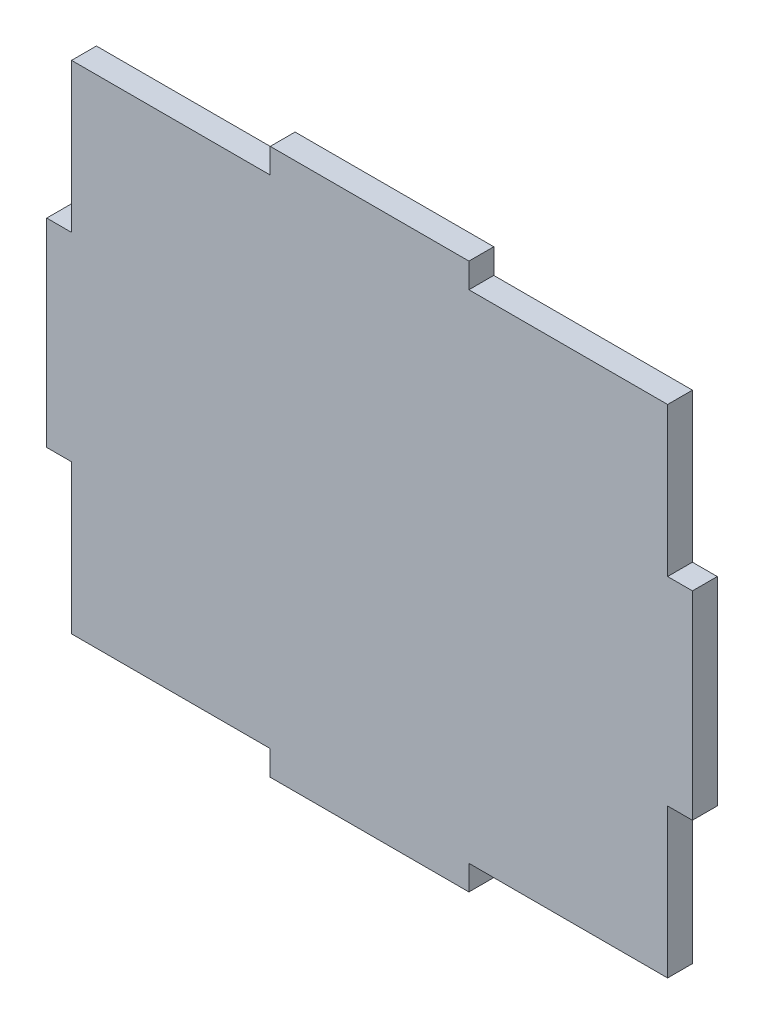
ISO-10303-21;
HEADER;
FILE_DESCRIPTION(('STEP AP214'),'2;1');
FILE_NAME('part.step','',(''),(''),'','','');
FILE_SCHEMA(('AUTOMOTIVE_DESIGN { 1 0 10303 214 1 1 1 1 }'));
ENDSEC;
DATA;
#1=APPLICATION_CONTEXT('core data for automotive mechanical design processes');
#2=APPLICATION_PROTOCOL_DEFINITION('international standard','automotive_design',2000,#1);
#3=PRODUCT_CONTEXT('',#1,'mechanical');
#4=PRODUCT('Part','Part','',(#3));
#5=PRODUCT_RELATED_PRODUCT_CATEGORY('part','',(#4));
#6=PRODUCT_DEFINITION_FORMATION('','',#4);
#7=PRODUCT_DEFINITION_CONTEXT('part definition',#1,'design');
#8=PRODUCT_DEFINITION('design','',#6,#7);
#9=PRODUCT_DEFINITION_SHAPE('','',#8);
#10=(LENGTH_UNIT() NAMED_UNIT(*) SI_UNIT(.MILLI.,.METRE.));
#11=(NAMED_UNIT(*) PLANE_ANGLE_UNIT() SI_UNIT($,.RADIAN.));
#12=(NAMED_UNIT(*) SI_UNIT($,.STERADIAN.) SOLID_ANGLE_UNIT());
#13=UNCERTAINTY_MEASURE_WITH_UNIT(LENGTH_MEASURE(1.E-05),#10,'distance_accuracy_value','');
#14=(GEOMETRIC_REPRESENTATION_CONTEXT(3) GLOBAL_UNCERTAINTY_ASSIGNED_CONTEXT((#13)) GLOBAL_UNIT_ASSIGNED_CONTEXT((#10,
#11,#12)) REPRESENTATION_CONTEXT('',''));
#15=CARTESIAN_POINT('',(0.,0.,0.));
#16=DIRECTION('',(0.,0.,1.));
#17=DIRECTION('',(1.,0.,0.));
#18=AXIS2_PLACEMENT_3D('',#15,#16,#17);
#19=CARTESIAN_POINT('',(-30.,-25.,1.25));
#20=DIRECTION('',(0.,1.,0.));
#21=DIRECTION('',(-1.,0.,0.));
#22=AXIS2_PLACEMENT_3D('',#19,#20,#21);
#23=PLANE('',#22);
#24=DIRECTION('',(1.,0.,0.));
#25=VECTOR('',#24,1.);
#26=CARTESIAN_POINT('',(-30.,-25.,-1.25));
#27=LINE('',#26,#25);
#28=CARTESIAN_POINT('',(-30.,-25.,-1.25));
#29=VERTEX_POINT('',#28);
#30=CARTESIAN_POINT('',(-10.,-25.,-1.25));
#31=VERTEX_POINT('',#30);
#32=EDGE_CURVE('E212',#29,#31,#27,.T.);
#33=ORIENTED_EDGE('',*,*,#32,.T.);
#34=DIRECTION('',(0.,0.,-1.));
#35=VECTOR('',#34,1.);
#36=CARTESIAN_POINT('',(-10.,-25.,1.25));
#37=LINE('',#36,#35);
#38=CARTESIAN_POINT('',(-10.,-25.,1.25));
#39=VERTEX_POINT('',#38);
#40=EDGE_CURVE('E11',#39,#31,#37,.T.);
#41=ORIENTED_EDGE('',*,*,#40,.F.);
#42=DIRECTION('',(1.,0.,0.));
#43=VECTOR('',#42,1.);
#44=CARTESIAN_POINT('',(-30.,-25.,1.25));
#45=LINE('',#44,#43);
#46=CARTESIAN_POINT('',(-30.,-25.,1.25));
#47=VERTEX_POINT('',#46);
#48=EDGE_CURVE('E270',#47,#39,#45,.T.);
#49=ORIENTED_EDGE('',*,*,#48,.F.);
#50=DIRECTION('',(0.,0.,-1.));
#51=VECTOR('',#50,1.);
#52=CARTESIAN_POINT('',(-30.,-25.,1.25));
#53=LINE('',#52,#51);
#54=EDGE_CURVE('E208',#47,#29,#53,.T.);
#55=ORIENTED_EDGE('',*,*,#54,.T.);
#56=EDGE_LOOP('',(#33,#41,#49,#55));
#57=FACE_BOUND('',#56,.T.);
#58=ADVANCED_FACE('F39',(#57),#23,.F.);
#59=CARTESIAN_POINT('',(-10.,-25.,1.25));
#60=DIRECTION('',(1.,0.,0.));
#61=DIRECTION('',(0.,1.,0.));
#62=AXIS2_PLACEMENT_3D('',#59,#60,#61);
#63=PLANE('',#62);
#64=DIRECTION('',(0.,-1.,0.));
#65=VECTOR('',#64,1.);
#66=CARTESIAN_POINT('',(-10.,-25.,-1.25));
#67=LINE('',#66,#65);
#68=CARTESIAN_POINT('',(-10.,-27.5,-1.25));
#69=VERTEX_POINT('',#68);
#70=EDGE_CURVE('E216',#31,#69,#67,.T.);
#71=ORIENTED_EDGE('',*,*,#70,.T.);
#72=DIRECTION('',(0.,0.,-1.));
#73=VECTOR('',#72,1.);
#74=CARTESIAN_POINT('',(-10.,-27.5,1.25));
#75=LINE('',#74,#73);
#76=CARTESIAN_POINT('',(-10.,-27.5,1.25));
#77=VERTEX_POINT('',#76);
#78=EDGE_CURVE('E48',#77,#69,#75,.T.);
#79=ORIENTED_EDGE('',*,*,#78,.F.);
#80=DIRECTION('',(0.,-1.,0.));
#81=VECTOR('',#80,1.);
#82=CARTESIAN_POINT('',(-10.,-25.,1.25));
#83=LINE('',#82,#81);
#84=EDGE_CURVE('E135',#39,#77,#83,.T.);
#85=ORIENTED_EDGE('',*,*,#84,.F.);
#86=ORIENTED_EDGE('',*,*,#40,.T.);
#87=EDGE_LOOP('',(#71,#79,#85,#86));
#88=FACE_BOUND('',#87,.T.);
#89=ADVANCED_FACE('F420',(#88),#63,.F.);
#90=CARTESIAN_POINT('',(-10.,-27.5,1.25));
#91=DIRECTION('',(0.,1.,0.));
#92=DIRECTION('',(0.,0.,1.));
#93=AXIS2_PLACEMENT_3D('',#90,#91,#92);
#94=PLANE('',#93);
#95=DIRECTION('',(1.,0.,0.));
#96=VECTOR('',#95,1.);
#97=CARTESIAN_POINT('',(-10.,-27.5,-1.25));
#98=LINE('',#97,#96);
#99=CARTESIAN_POINT('',(10.,-27.5,-1.25));
#100=VERTEX_POINT('',#99);
#101=EDGE_CURVE('E219',#69,#100,#98,.T.);
#102=ORIENTED_EDGE('',*,*,#101,.T.);
#103=DIRECTION('',(0.,0.,-1.));
#104=VECTOR('',#103,1.);
#105=CARTESIAN_POINT('',(10.,-27.5,1.25));
#106=LINE('',#105,#104);
#107=CARTESIAN_POINT('',(10.,-27.5,1.25));
#108=VERTEX_POINT('',#107);
#109=EDGE_CURVE('E329',#108,#100,#106,.T.);
#110=ORIENTED_EDGE('',*,*,#109,.F.);
#111=DIRECTION('',(1.,0.,0.));
#112=VECTOR('',#111,1.);
#113=CARTESIAN_POINT('',(-10.,-27.5,1.25));
#114=LINE('',#113,#112);
#115=EDGE_CURVE('E339',#77,#108,#114,.T.);
#116=ORIENTED_EDGE('',*,*,#115,.F.);
#117=ORIENTED_EDGE('',*,*,#78,.T.);
#118=EDGE_LOOP('',(#102,#110,#116,#117));
#119=FACE_BOUND('',#118,.T.);
#120=ADVANCED_FACE('F337',(#119),#94,.F.);
#121=CARTESIAN_POINT('',(10.,-25.,1.25));
#122=DIRECTION('',(-1.,0.,0.));
#123=DIRECTION('',(0.,-1.,0.));
#124=AXIS2_PLACEMENT_3D('',#121,#122,#123);
#125=PLANE('',#124);
#126=DIRECTION('',(0.,1.,0.));
#127=VECTOR('',#126,1.);
#128=CARTESIAN_POINT('',(10.,-25.,-1.25));
#129=LINE('',#128,#127);
#130=CARTESIAN_POINT('',(10.,-25.,-1.25));
#131=VERTEX_POINT('',#130);
#132=EDGE_CURVE('E222',#100,#131,#129,.T.);
#133=ORIENTED_EDGE('',*,*,#132,.T.);
#134=DIRECTION('',(0.,0.,-1.));
#135=VECTOR('',#134,1.);
#136=CARTESIAN_POINT('',(10.,-25.,1.25));
#137=LINE('',#136,#135);
#138=CARTESIAN_POINT('',(10.,-25.,1.25));
#139=VERTEX_POINT('',#138);
#140=EDGE_CURVE('E325',#139,#131,#137,.T.);
#141=ORIENTED_EDGE('',*,*,#140,.F.);
#142=DIRECTION('',(0.,1.,0.));
#143=VECTOR('',#142,1.);
#144=CARTESIAN_POINT('',(10.,-25.,1.25));
#145=LINE('',#144,#143);
#146=EDGE_CURVE('E358',#108,#139,#145,.T.);
#147=ORIENTED_EDGE('',*,*,#146,.F.);
#148=ORIENTED_EDGE('',*,*,#109,.T.);
#149=EDGE_LOOP('',(#133,#141,#147,#148));
#150=FACE_BOUND('',#149,.T.);
#151=ADVANCED_FACE('F348',(#150),#125,.F.);
#152=CARTESIAN_POINT('',(30.,-25.,1.25));
#153=DIRECTION('',(0.,1.,0.));
#154=DIRECTION('',(-1.,0.,0.));
#155=AXIS2_PLACEMENT_3D('',#152,#153,#154);
#156=PLANE('',#155);
#157=DIRECTION('',(1.,0.,0.));
#158=VECTOR('',#157,1.);
#159=CARTESIAN_POINT('',(30.,-25.,-1.25));
#160=LINE('',#159,#158);
#161=CARTESIAN_POINT('',(30.,-25.,-1.25));
#162=VERTEX_POINT('',#161);
#163=EDGE_CURVE('E225',#131,#162,#160,.T.);
#164=ORIENTED_EDGE('',*,*,#163,.T.);
#165=DIRECTION('',(0.,0.,-1.));
#166=VECTOR('',#165,1.);
#167=CARTESIAN_POINT('',(30.,-25.,1.25));
#168=LINE('',#167,#166);
#169=CARTESIAN_POINT('',(30.,-25.,1.25));
#170=VERTEX_POINT('',#169);
#171=EDGE_CURVE('E321',#170,#162,#168,.T.);
#172=ORIENTED_EDGE('',*,*,#171,.F.);
#173=DIRECTION('',(1.,0.,0.));
#174=VECTOR('',#173,1.);
#175=CARTESIAN_POINT('',(30.,-25.,1.25));
#176=LINE('',#175,#174);
#177=EDGE_CURVE('E354',#139,#170,#176,.T.);
#178=ORIENTED_EDGE('',*,*,#177,.F.);
#179=ORIENTED_EDGE('',*,*,#140,.T.);
#180=EDGE_LOOP('',(#164,#172,#178,#179));
#181=FACE_BOUND('',#180,.T.);
#182=ADVANCED_FACE('F352',(#181),#156,.F.);
#183=CARTESIAN_POINT('',(30.,-9.99999999999998,1.25));
#184=DIRECTION('',(-1.,0.,0.));
#185=DIRECTION('',(0.,-1.,0.));
#186=AXIS2_PLACEMENT_3D('',#183,#184,#185);
#187=PLANE('',#186);
#188=DIRECTION('',(0.,1.,0.));
#189=VECTOR('',#188,1.);
#190=CARTESIAN_POINT('',(30.,-9.99999999999998,-1.25));
#191=LINE('',#190,#189);
#192=CARTESIAN_POINT('',(30.,-9.99999999999998,-1.25));
#193=VERTEX_POINT('',#192);
#194=EDGE_CURVE('E228',#162,#193,#191,.T.);
#195=ORIENTED_EDGE('',*,*,#194,.T.);
#196=DIRECTION('',(0.,0.,-1.));
#197=VECTOR('',#196,1.);
#198=CARTESIAN_POINT('',(30.,-9.99999999999998,1.25));
#199=LINE('',#198,#197);
#200=CARTESIAN_POINT('',(30.,-9.99999999999998,1.25));
#201=VERTEX_POINT('',#200);
#202=EDGE_CURVE('E317',#201,#193,#199,.T.);
#203=ORIENTED_EDGE('',*,*,#202,.F.);
#204=DIRECTION('',(0.,1.,0.));
#205=VECTOR('',#204,1.);
#206=CARTESIAN_POINT('',(30.,-9.99999999999998,1.25));
#207=LINE('',#206,#205);
#208=EDGE_CURVE('E357',#170,#201,#207,.T.);
#209=ORIENTED_EDGE('',*,*,#208,.F.);
#210=ORIENTED_EDGE('',*,*,#171,.T.);
#211=EDGE_LOOP('',(#195,#203,#209,#210));
#212=FACE_BOUND('',#211,.T.);
#213=ADVANCED_FACE('F433',(#212),#187,.F.);
#214=CARTESIAN_POINT('',(32.5,-10.,1.25));
#215=DIRECTION('',(0.,1.,0.));
#216=DIRECTION('',(-1.,0.,0.));
#217=AXIS2_PLACEMENT_3D('',#214,#215,#216);
#218=PLANE('',#217);
#219=DIRECTION('',(1.,0.,0.));
#220=VECTOR('',#219,1.);
#221=CARTESIAN_POINT('',(32.5,-10.,-1.25));
#222=LINE('',#221,#220);
#223=CARTESIAN_POINT('',(32.5,-10.,-1.25));
#224=VERTEX_POINT('',#223);
#225=EDGE_CURVE('E231',#193,#224,#222,.T.);
#226=ORIENTED_EDGE('',*,*,#225,.T.);
#227=DIRECTION('',(0.,0.,-1.));
#228=VECTOR('',#227,1.);
#229=CARTESIAN_POINT('',(32.5,-10.,1.25));
#230=LINE('',#229,#228);
#231=CARTESIAN_POINT('',(32.5,-10.,1.25));
#232=VERTEX_POINT('',#231);
#233=EDGE_CURVE('E313',#232,#224,#230,.T.);
#234=ORIENTED_EDGE('',*,*,#233,.F.);
#235=DIRECTION('',(1.,0.,0.));
#236=VECTOR('',#235,1.);
#237=CARTESIAN_POINT('',(32.5,-10.,1.25));
#238=LINE('',#237,#236);
#239=EDGE_CURVE('E362',#201,#232,#238,.T.);
#240=ORIENTED_EDGE('',*,*,#239,.F.);
#241=ORIENTED_EDGE('',*,*,#202,.T.);
#242=EDGE_LOOP('',(#226,#234,#240,#241));
#243=FACE_BOUND('',#242,.T.);
#244=ADVANCED_FACE('F436',(#243),#218,.F.);
#245=CARTESIAN_POINT('',(32.5,10.,1.25));
#246=DIRECTION('',(-1.,0.,0.));
#247=DIRECTION('',(0.,0.,1.));
#248=AXIS2_PLACEMENT_3D('',#245,#246,#247);
#249=PLANE('',#248);
#250=DIRECTION('',(0.,1.,0.));
#251=VECTOR('',#250,1.);
#252=CARTESIAN_POINT('',(32.5,10.,-1.25));
#253=LINE('',#252,#251);
#254=CARTESIAN_POINT('',(32.5,10.,-1.25));
#255=VERTEX_POINT('',#254);
#256=EDGE_CURVE('E234',#224,#255,#253,.T.);
#257=ORIENTED_EDGE('',*,*,#256,.T.);
#258=DIRECTION('',(0.,0.,-1.));
#259=VECTOR('',#258,1.);
#260=CARTESIAN_POINT('',(32.5,10.,1.25));
#261=LINE('',#260,#259);
#262=CARTESIAN_POINT('',(32.5,10.,1.25));
#263=VERTEX_POINT('',#262);
#264=EDGE_CURVE('E309',#263,#255,#261,.T.);
#265=ORIENTED_EDGE('',*,*,#264,.F.);
#266=DIRECTION('',(0.,1.,0.));
#267=VECTOR('',#266,1.);
#268=CARTESIAN_POINT('',(32.5,10.,1.25));
#269=LINE('',#268,#267);
#270=EDGE_CURVE('E369',#232,#263,#269,.T.);
#271=ORIENTED_EDGE('',*,*,#270,.F.);
#272=ORIENTED_EDGE('',*,*,#233,.T.);
#273=EDGE_LOOP('',(#257,#265,#271,#272));
#274=FACE_BOUND('',#273,.T.);
#275=ADVANCED_FACE('F440',(#274),#249,.F.);
#276=CARTESIAN_POINT('',(32.5,10.,1.25));
#277=DIRECTION('',(0.,-1.,0.));
#278=DIRECTION('',(1.,0.,0.));
#279=AXIS2_PLACEMENT_3D('',#276,#277,#278);
#280=PLANE('',#279);
#281=DIRECTION('',(-1.,0.,0.));
#282=VECTOR('',#281,1.);
#283=CARTESIAN_POINT('',(32.5,10.,-1.25));
#284=LINE('',#283,#282);
#285=CARTESIAN_POINT('',(30.,9.99999999999998,-1.25));
#286=VERTEX_POINT('',#285);
#287=EDGE_CURVE('E237',#255,#286,#284,.T.);
#288=ORIENTED_EDGE('',*,*,#287,.T.);
#289=DIRECTION('',(0.,0.,-1.));
#290=VECTOR('',#289,1.);
#291=CARTESIAN_POINT('',(30.,9.99999999999998,1.25));
#292=LINE('',#291,#290);
#293=CARTESIAN_POINT('',(30.,9.99999999999998,1.25));
#294=VERTEX_POINT('',#293);
#295=EDGE_CURVE('E305',#294,#286,#292,.T.);
#296=ORIENTED_EDGE('',*,*,#295,.F.);
#297=DIRECTION('',(-1.,0.,0.));
#298=VECTOR('',#297,1.);
#299=CARTESIAN_POINT('',(32.5,10.,1.25));
#300=LINE('',#299,#298);
#301=EDGE_CURVE('E372',#263,#294,#300,.T.);
#302=ORIENTED_EDGE('',*,*,#301,.F.);
#303=ORIENTED_EDGE('',*,*,#264,.T.);
#304=EDGE_LOOP('',(#288,#296,#302,#303));
#305=FACE_BOUND('',#304,.T.);
#306=ADVANCED_FACE('F444',(#305),#280,.F.);
#307=CARTESIAN_POINT('',(30.,9.99999999999998,1.25));
#308=DIRECTION('',(-1.,0.,0.));
#309=DIRECTION('',(0.,-1.,0.));
#310=AXIS2_PLACEMENT_3D('',#307,#308,#309);
#311=PLANE('',#310);
#312=DIRECTION('',(0.,1.,0.));
#313=VECTOR('',#312,1.);
#314=CARTESIAN_POINT('',(30.,9.99999999999998,-1.25));
#315=LINE('',#314,#313);
#316=CARTESIAN_POINT('',(30.,25.,-1.25));
#317=VERTEX_POINT('',#316);
#318=EDGE_CURVE('E240',#286,#317,#315,.T.);
#319=ORIENTED_EDGE('',*,*,#318,.T.);
#320=DIRECTION('',(0.,0.,-1.));
#321=VECTOR('',#320,1.);
#322=CARTESIAN_POINT('',(30.,25.,1.25));
#323=LINE('',#322,#321);
#324=CARTESIAN_POINT('',(30.,25.,1.25));
#325=VERTEX_POINT('',#324);
#326=EDGE_CURVE('E301',#325,#317,#323,.T.);
#327=ORIENTED_EDGE('',*,*,#326,.F.);
#328=DIRECTION('',(0.,1.,0.));
#329=VECTOR('',#328,1.);
#330=CARTESIAN_POINT('',(30.,9.99999999999998,1.25));
#331=LINE('',#330,#329);
#332=EDGE_CURVE('E375',#294,#325,#331,.T.);
#333=ORIENTED_EDGE('',*,*,#332,.F.);
#334=ORIENTED_EDGE('',*,*,#295,.T.);
#335=EDGE_LOOP('',(#319,#327,#333,#334));
#336=FACE_BOUND('',#335,.T.);
#337=ADVANCED_FACE('F448',(#336),#311,.F.);
#338=CARTESIAN_POINT('',(30.,25.,1.25));
#339=DIRECTION('',(0.,-1.,0.));
#340=DIRECTION('',(1.,0.,0.));
#341=AXIS2_PLACEMENT_3D('',#338,#339,#340);
#342=PLANE('',#341);
#343=DIRECTION('',(-1.,0.,0.));
#344=VECTOR('',#343,1.);
#345=CARTESIAN_POINT('',(30.,25.,-1.25));
#346=LINE('',#345,#344);
#347=CARTESIAN_POINT('',(10.,25.,-1.25));
#348=VERTEX_POINT('',#347);
#349=EDGE_CURVE('E243',#317,#348,#346,.T.);
#350=ORIENTED_EDGE('',*,*,#349,.T.);
#351=DIRECTION('',(0.,0.,-1.));
#352=VECTOR('',#351,1.);
#353=CARTESIAN_POINT('',(10.,25.,1.25));
#354=LINE('',#353,#352);
#355=CARTESIAN_POINT('',(10.,25.,1.25));
#356=VERTEX_POINT('',#355);
#357=EDGE_CURVE('E297',#356,#348,#354,.T.);
#358=ORIENTED_EDGE('',*,*,#357,.F.);
#359=DIRECTION('',(-1.,0.,0.));
#360=VECTOR('',#359,1.);
#361=CARTESIAN_POINT('',(30.,25.,1.25));
#362=LINE('',#361,#360);
#363=EDGE_CURVE('E378',#325,#356,#362,.T.);
#364=ORIENTED_EDGE('',*,*,#363,.F.);
#365=ORIENTED_EDGE('',*,*,#326,.T.);
#366=EDGE_LOOP('',(#350,#358,#364,#365));
#367=FACE_BOUND('',#366,.T.);
#368=ADVANCED_FACE('F452',(#367),#342,.F.);
#369=CARTESIAN_POINT('',(10.,25.,1.25));
#370=DIRECTION('',(-1.,0.,0.));
#371=DIRECTION('',(0.,-1.,0.));
#372=AXIS2_PLACEMENT_3D('',#369,#370,#371);
#373=PLANE('',#372);
#374=DIRECTION('',(0.,1.,0.));
#375=VECTOR('',#374,1.);
#376=CARTESIAN_POINT('',(10.,25.,-1.25));
#377=LINE('',#376,#375);
#378=CARTESIAN_POINT('',(10.,27.5,-1.25));
#379=VERTEX_POINT('',#378);
#380=EDGE_CURVE('E246',#348,#379,#377,.T.);
#381=ORIENTED_EDGE('',*,*,#380,.T.);
#382=DIRECTION('',(0.,0.,-1.));
#383=VECTOR('',#382,1.);
#384=CARTESIAN_POINT('',(10.,27.5,1.25));
#385=LINE('',#384,#383);
#386=CARTESIAN_POINT('',(10.,27.5,1.25));
#387=VERTEX_POINT('',#386);
#388=EDGE_CURVE('E293',#387,#379,#385,.T.);
#389=ORIENTED_EDGE('',*,*,#388,.F.);
#390=DIRECTION('',(0.,1.,0.));
#391=VECTOR('',#390,1.);
#392=CARTESIAN_POINT('',(10.,25.,1.25));
#393=LINE('',#392,#391);
#394=EDGE_CURVE('E381',#356,#387,#393,.T.);
#395=ORIENTED_EDGE('',*,*,#394,.F.);
#396=ORIENTED_EDGE('',*,*,#357,.T.);
#397=EDGE_LOOP('',(#381,#389,#395,#396));
#398=FACE_BOUND('',#397,.T.);
#399=ADVANCED_FACE('F456',(#398),#373,.F.);
#400=CARTESIAN_POINT('',(-10.,27.5,1.25));
#401=DIRECTION('',(0.,-1.,0.));
#402=DIRECTION('',(0.,0.,-1.));
#403=AXIS2_PLACEMENT_3D('',#400,#401,#402);
#404=PLANE('',#403);
#405=DIRECTION('',(-1.,0.,0.));
#406=VECTOR('',#405,1.);
#407=CARTESIAN_POINT('',(-10.,27.5,-1.25));
#408=LINE('',#407,#406);
#409=CARTESIAN_POINT('',(-10.,27.5,-1.25));
#410=VERTEX_POINT('',#409);
#411=EDGE_CURVE('E249',#379,#410,#408,.T.);
#412=ORIENTED_EDGE('',*,*,#411,.T.);
#413=DIRECTION('',(0.,0.,-1.));
#414=VECTOR('',#413,1.);
#415=CARTESIAN_POINT('',(-10.,27.5,1.25));
#416=LINE('',#415,#414);
#417=CARTESIAN_POINT('',(-10.,27.5,1.25));
#418=VERTEX_POINT('',#417);
#419=EDGE_CURVE('E289',#418,#410,#416,.T.);
#420=ORIENTED_EDGE('',*,*,#419,.F.);
#421=DIRECTION('',(-1.,0.,0.));
#422=VECTOR('',#421,1.);
#423=CARTESIAN_POINT('',(-10.,27.5,1.25));
#424=LINE('',#423,#422);
#425=EDGE_CURVE('E384',#387,#418,#424,.T.);
#426=ORIENTED_EDGE('',*,*,#425,.F.);
#427=ORIENTED_EDGE('',*,*,#388,.T.);
#428=EDGE_LOOP('',(#412,#420,#426,#427));
#429=FACE_BOUND('',#428,.T.);
#430=ADVANCED_FACE('F460',(#429),#404,.F.);
#431=CARTESIAN_POINT('',(-10.,25.,1.25));
#432=DIRECTION('',(1.,0.,0.));
#433=DIRECTION('',(0.,1.,0.));
#434=AXIS2_PLACEMENT_3D('',#431,#432,#433);
#435=PLANE('',#434);
#436=DIRECTION('',(0.,-1.,0.));
#437=VECTOR('',#436,1.);
#438=CARTESIAN_POINT('',(-10.,25.,-1.25));
#439=LINE('',#438,#437);
#440=CARTESIAN_POINT('',(-10.,25.,-1.25));
#441=VERTEX_POINT('',#440);
#442=EDGE_CURVE('E252',#410,#441,#439,.T.);
#443=ORIENTED_EDGE('',*,*,#442,.T.);
#444=DIRECTION('',(0.,0.,-1.));
#445=VECTOR('',#444,1.);
#446=CARTESIAN_POINT('',(-10.,25.,1.25));
#447=LINE('',#446,#445);
#448=CARTESIAN_POINT('',(-10.,25.,1.25));
#449=VERTEX_POINT('',#448);
#450=EDGE_CURVE('E285',#449,#441,#447,.T.);
#451=ORIENTED_EDGE('',*,*,#450,.F.);
#452=DIRECTION('',(0.,-1.,0.));
#453=VECTOR('',#452,1.);
#454=CARTESIAN_POINT('',(-10.,25.,1.25));
#455=LINE('',#454,#453);
#456=EDGE_CURVE('E387',#418,#449,#455,.T.);
#457=ORIENTED_EDGE('',*,*,#456,.F.);
#458=ORIENTED_EDGE('',*,*,#419,.T.);
#459=EDGE_LOOP('',(#443,#451,#457,#458));
#460=FACE_BOUND('',#459,.T.);
#461=ADVANCED_FACE('F464',(#460),#435,.F.);
#462=CARTESIAN_POINT('',(-30.,25.,1.25));
#463=DIRECTION('',(0.,-1.,0.));
#464=DIRECTION('',(0.,0.,-1.));
#465=AXIS2_PLACEMENT_3D('',#462,#463,#464);
#466=PLANE('',#465);
#467=DIRECTION('',(-1.,0.,0.));
#468=VECTOR('',#467,1.);
#469=CARTESIAN_POINT('',(-30.,25.,-1.25));
#470=LINE('',#469,#468);
#471=CARTESIAN_POINT('',(-30.,25.,-1.25));
#472=VERTEX_POINT('',#471);
#473=EDGE_CURVE('E255',#441,#472,#470,.T.);
#474=ORIENTED_EDGE('',*,*,#473,.T.);
#475=DIRECTION('',(0.,0.,-1.));
#476=VECTOR('',#475,1.);
#477=CARTESIAN_POINT('',(-30.,25.,1.25));
#478=LINE('',#477,#476);
#479=CARTESIAN_POINT('',(-30.,25.,1.25));
#480=VERTEX_POINT('',#479);
#481=EDGE_CURVE('E281',#480,#472,#478,.T.);
#482=ORIENTED_EDGE('',*,*,#481,.F.);
#483=DIRECTION('',(-1.,0.,0.));
#484=VECTOR('',#483,1.);
#485=CARTESIAN_POINT('',(-30.,25.,1.25));
#486=LINE('',#485,#484);
#487=EDGE_CURVE('E390',#449,#480,#486,.T.);
#488=ORIENTED_EDGE('',*,*,#487,.F.);
#489=ORIENTED_EDGE('',*,*,#450,.T.);
#490=EDGE_LOOP('',(#474,#482,#488,#489));
#491=FACE_BOUND('',#490,.T.);
#492=ADVANCED_FACE('F468',(#491),#466,.F.);
#493=CARTESIAN_POINT('',(-30.,9.99999999999998,1.25));
#494=DIRECTION('',(1.,0.,0.));
#495=DIRECTION('',(0.,1.,0.));
#496=AXIS2_PLACEMENT_3D('',#493,#494,#495);
#497=PLANE('',#496);
#498=DIRECTION('',(0.,-1.,0.));
#499=VECTOR('',#498,1.);
#500=CARTESIAN_POINT('',(-30.,9.99999999999998,-1.25));
#501=LINE('',#500,#499);
#502=CARTESIAN_POINT('',(-30.,9.99999999999998,-1.25));
#503=VERTEX_POINT('',#502);
#504=EDGE_CURVE('E258',#472,#503,#501,.T.);
#505=ORIENTED_EDGE('',*,*,#504,.T.);
#506=DIRECTION('',(0.,0.,-1.));
#507=VECTOR('',#506,1.);
#508=CARTESIAN_POINT('',(-30.,9.99999999999998,1.25));
#509=LINE('',#508,#507);
#510=CARTESIAN_POINT('',(-30.,9.99999999999998,1.25));
#511=VERTEX_POINT('',#510);
#512=EDGE_CURVE('E277',#511,#503,#509,.T.);
#513=ORIENTED_EDGE('',*,*,#512,.F.);
#514=DIRECTION('',(0.,-1.,0.));
#515=VECTOR('',#514,1.);
#516=CARTESIAN_POINT('',(-30.,9.99999999999998,1.25));
#517=LINE('',#516,#515);
#518=EDGE_CURVE('E393',#480,#511,#517,.T.);
#519=ORIENTED_EDGE('',*,*,#518,.F.);
#520=ORIENTED_EDGE('',*,*,#481,.T.);
#521=EDGE_LOOP('',(#505,#513,#519,#520));
#522=FACE_BOUND('',#521,.T.);
#523=ADVANCED_FACE('F401',(#522),#497,.F.);
#524=CARTESIAN_POINT('',(-32.5,10.,1.25));
#525=DIRECTION('',(0.,-1.,0.));
#526=DIRECTION('',(1.,0.,0.));
#527=AXIS2_PLACEMENT_3D('',#524,#525,#526);
#528=PLANE('',#527);
#529=DIRECTION('',(-1.,0.,0.));
#530=VECTOR('',#529,1.);
#531=CARTESIAN_POINT('',(-32.5,10.,-1.25));
#532=LINE('',#531,#530);
#533=CARTESIAN_POINT('',(-32.5,10.,-1.25));
#534=VERTEX_POINT('',#533);
#535=EDGE_CURVE('E261',#503,#534,#532,.T.);
#536=ORIENTED_EDGE('',*,*,#535,.T.);
#537=DIRECTION('',(0.,0.,-1.));
#538=VECTOR('',#537,1.);
#539=CARTESIAN_POINT('',(-32.5,10.,1.25));
#540=LINE('',#539,#538);
#541=CARTESIAN_POINT('',(-32.5,10.,1.25));
#542=VERTEX_POINT('',#541);
#543=EDGE_CURVE('E201',#542,#534,#540,.T.);
#544=ORIENTED_EDGE('',*,*,#543,.F.);
#545=DIRECTION('',(-1.,0.,0.));
#546=VECTOR('',#545,1.);
#547=CARTESIAN_POINT('',(-32.5,10.,1.25));
#548=LINE('',#547,#546);
#549=EDGE_CURVE('E190',#511,#542,#548,.T.);
#550=ORIENTED_EDGE('',*,*,#549,.F.);
#551=ORIENTED_EDGE('',*,*,#512,.T.);
#552=EDGE_LOOP('',(#536,#544,#550,#551));
#553=FACE_BOUND('',#552,.T.);
#554=ADVANCED_FACE('F405',(#553),#528,.F.);
#555=CARTESIAN_POINT('',(-32.5,10.,1.25));
#556=DIRECTION('',(1.,0.,0.));
#557=DIRECTION('',(0.,0.,-1.));
#558=AXIS2_PLACEMENT_3D('',#555,#556,#557);
#559=PLANE('',#558);
#560=DIRECTION('',(0.,-1.,0.));
#561=VECTOR('',#560,1.);
#562=CARTESIAN_POINT('',(-32.5,10.,-1.25));
#563=LINE('',#562,#561);
#564=CARTESIAN_POINT('',(-32.5,-10.,-1.25));
#565=VERTEX_POINT('',#564);
#566=EDGE_CURVE('E199',#534,#565,#563,.T.);
#567=ORIENTED_EDGE('',*,*,#566,.T.);
#568=DIRECTION('',(0.,0.,-1.));
#569=VECTOR('',#568,1.);
#570=CARTESIAN_POINT('',(-32.5,-10.,1.25));
#571=LINE('',#570,#569);
#572=CARTESIAN_POINT('',(-32.5,-10.,1.25));
#573=VERTEX_POINT('',#572);
#574=EDGE_CURVE('E196',#573,#565,#571,.T.);
#575=ORIENTED_EDGE('',*,*,#574,.F.);
#576=DIRECTION('',(0.,-1.,0.));
#577=VECTOR('',#576,1.);
#578=CARTESIAN_POINT('',(-32.5,10.,1.25));
#579=LINE('',#578,#577);
#580=EDGE_CURVE('E184',#542,#573,#579,.T.);
#581=ORIENTED_EDGE('',*,*,#580,.F.);
#582=ORIENTED_EDGE('',*,*,#543,.T.);
#583=EDGE_LOOP('',(#567,#575,#581,#582));
#584=FACE_BOUND('',#583,.T.);
#585=ADVANCED_FACE('F197',(#584),#559,.F.);
#586=CARTESIAN_POINT('',(-32.5,-10.,1.25));
#587=DIRECTION('',(0.,1.,0.));
#588=DIRECTION('',(-1.,0.,0.));
#589=AXIS2_PLACEMENT_3D('',#586,#587,#588);
#590=PLANE('',#589);
#591=DIRECTION('',(1.,0.,0.));
#592=VECTOR('',#591,1.);
#593=CARTESIAN_POINT('',(-32.5,-10.,-1.25));
#594=LINE('',#593,#592);
#595=CARTESIAN_POINT('',(-30.,-9.99999999999998,-1.25));
#596=VERTEX_POINT('',#595);
#597=EDGE_CURVE('E121',#565,#596,#594,.T.);
#598=ORIENTED_EDGE('',*,*,#597,.T.);
#599=DIRECTION('',(0.,0.,-1.));
#600=VECTOR('',#599,1.);
#601=CARTESIAN_POINT('',(-30.,-9.99999999999998,1.25));
#602=LINE('',#601,#600);
#603=CARTESIAN_POINT('',(-30.,-9.99999999999998,1.25));
#604=VERTEX_POINT('',#603);
#605=EDGE_CURVE('E202',#604,#596,#602,.T.);
#606=ORIENTED_EDGE('',*,*,#605,.F.);
#607=DIRECTION('',(1.,0.,0.));
#608=VECTOR('',#607,1.);
#609=CARTESIAN_POINT('',(-32.5,-10.,1.25));
#610=LINE('',#609,#608);
#611=EDGE_CURVE('E188',#573,#604,#610,.T.);
#612=ORIENTED_EDGE('',*,*,#611,.F.);
#613=ORIENTED_EDGE('',*,*,#574,.T.);
#614=EDGE_LOOP('',(#598,#606,#612,#613));
#615=FACE_BOUND('',#614,.T.);
#616=ADVANCED_FACE('F204',(#615),#590,.F.);
#617=CARTESIAN_POINT('',(-30.,-9.99999999999998,1.25));
#618=DIRECTION('',(1.,0.,0.));
#619=DIRECTION('',(0.,1.,0.));
#620=AXIS2_PLACEMENT_3D('',#617,#618,#619);
#621=PLANE('',#620);
#622=DIRECTION('',(0.,-1.,0.));
#623=VECTOR('',#622,1.);
#624=CARTESIAN_POINT('',(-30.,-9.99999999999998,-1.25));
#625=LINE('',#624,#623);
#626=EDGE_CURVE('E127',#596,#29,#625,.T.);
#627=ORIENTED_EDGE('',*,*,#626,.T.);
#628=ORIENTED_EDGE('',*,*,#54,.F.);
#629=DIRECTION('',(0.,-1.,0.));
#630=VECTOR('',#629,1.);
#631=CARTESIAN_POINT('',(-30.,-9.99999999999998,1.25));
#632=LINE('',#631,#630);
#633=EDGE_CURVE('E56',#604,#47,#632,.T.);
#634=ORIENTED_EDGE('',*,*,#633,.F.);
#635=ORIENTED_EDGE('',*,*,#605,.T.);
#636=EDGE_LOOP('',(#627,#628,#634,#635));
#637=FACE_BOUND('',#636,.T.);
#638=ADVANCED_FACE('F409',(#637),#621,.F.);
#639=CARTESIAN_POINT('',(0.,0.,1.25));
#640=DIRECTION('',(0.,0.,-1.));
#641=DIRECTION('',(-1.,0.,0.));
#642=AXIS2_PLACEMENT_3D('',#639,#640,#641);
#643=PLANE('',#642);
#644=ORIENTED_EDGE('',*,*,#48,.T.);
#645=ORIENTED_EDGE('',*,*,#84,.T.);
#646=ORIENTED_EDGE('',*,*,#115,.T.);
#647=ORIENTED_EDGE('',*,*,#146,.T.);
#648=ORIENTED_EDGE('',*,*,#177,.T.);
#649=ORIENTED_EDGE('',*,*,#208,.T.);
#650=ORIENTED_EDGE('',*,*,#239,.T.);
#651=ORIENTED_EDGE('',*,*,#270,.T.);
#652=ORIENTED_EDGE('',*,*,#301,.T.);
#653=ORIENTED_EDGE('',*,*,#332,.T.);
#654=ORIENTED_EDGE('',*,*,#363,.T.);
#655=ORIENTED_EDGE('',*,*,#394,.T.);
#656=ORIENTED_EDGE('',*,*,#425,.T.);
#657=ORIENTED_EDGE('',*,*,#456,.T.);
#658=ORIENTED_EDGE('',*,*,#487,.T.);
#659=ORIENTED_EDGE('',*,*,#518,.T.);
#660=ORIENTED_EDGE('',*,*,#549,.T.);
#661=ORIENTED_EDGE('',*,*,#580,.T.);
#662=ORIENTED_EDGE('',*,*,#611,.T.);
#663=ORIENTED_EDGE('',*,*,#633,.T.);
#664=EDGE_LOOP('',(#644,#645,#646,#647,#648,#649,#650,#651,#652,#653,#654,#655,#656,#657,#658,
#659,#660,#661,#662,#663));
#665=FACE_BOUND('',#664,.T.);
#666=ADVANCED_FACE('F186',(#665),#643,.F.);
#667=CARTESIAN_POINT('',(0.,0.,-1.25));
#668=DIRECTION('',(0.,0.,-1.));
#669=DIRECTION('',(-1.,0.,0.));
#670=AXIS2_PLACEMENT_3D('',#667,#668,#669);
#671=PLANE('',#670);
#672=ORIENTED_EDGE('',*,*,#32,.F.);
#673=ORIENTED_EDGE('',*,*,#626,.F.);
#674=ORIENTED_EDGE('',*,*,#597,.F.);
#675=ORIENTED_EDGE('',*,*,#566,.F.);
#676=ORIENTED_EDGE('',*,*,#535,.F.);
#677=ORIENTED_EDGE('',*,*,#504,.F.);
#678=ORIENTED_EDGE('',*,*,#473,.F.);
#679=ORIENTED_EDGE('',*,*,#442,.F.);
#680=ORIENTED_EDGE('',*,*,#411,.F.);
#681=ORIENTED_EDGE('',*,*,#380,.F.);
#682=ORIENTED_EDGE('',*,*,#349,.F.);
#683=ORIENTED_EDGE('',*,*,#318,.F.);
#684=ORIENTED_EDGE('',*,*,#287,.F.);
#685=ORIENTED_EDGE('',*,*,#256,.F.);
#686=ORIENTED_EDGE('',*,*,#225,.F.);
#687=ORIENTED_EDGE('',*,*,#194,.F.);
#688=ORIENTED_EDGE('',*,*,#163,.F.);
#689=ORIENTED_EDGE('',*,*,#132,.F.);
#690=ORIENTED_EDGE('',*,*,#101,.F.);
#691=ORIENTED_EDGE('',*,*,#70,.F.);
#692=EDGE_LOOP('',(#672,#673,#674,#675,#676,#677,#678,#679,#680,#681,#682,#683,#684,#685,#686,
#687,#688,#689,#690,#691));
#693=FACE_BOUND('',#692,.T.);
#694=ADVANCED_FACE('F343',(#693),#671,.T.);
#695=CLOSED_SHELL('',(#58,#89,#120,#151,#182,#213,#244,#275,#306,#337,#368,#399,#430,#461,#492,
#523,#554,#585,#616,#638,#666,#694));
#696=MANIFOLD_SOLID_BREP('B2',#695);
#697=ADVANCED_BREP_SHAPE_REPRESENTATION('',(#18,#696),#14);
#698=SHAPE_DEFINITION_REPRESENTATION(#9,#697);
ENDSEC;
END-ISO-10303-21;
